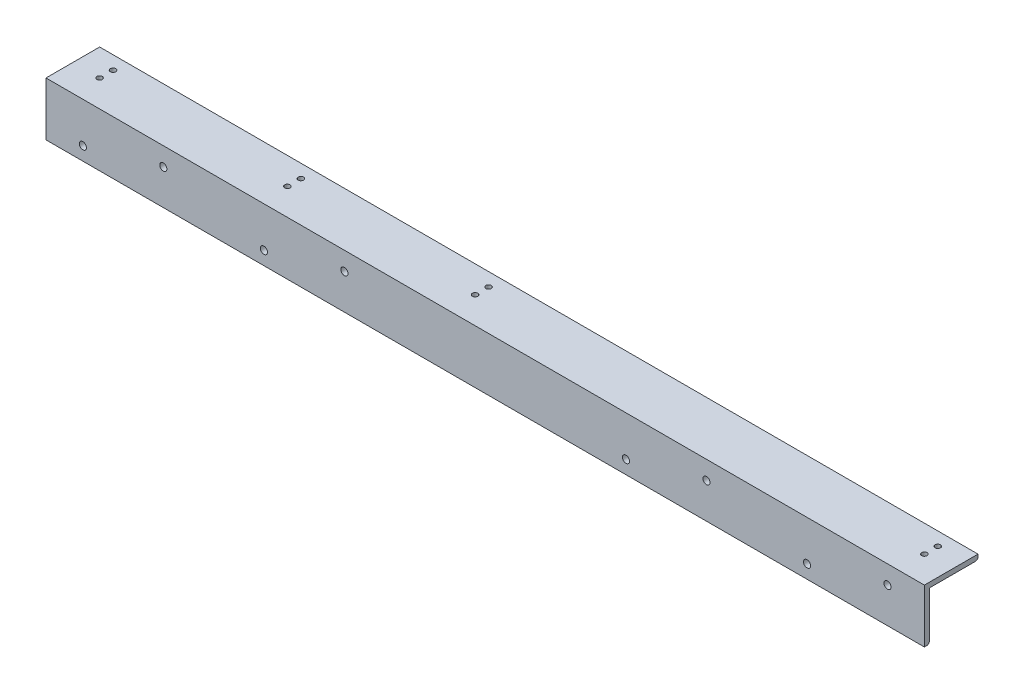
ISO-10303-21;
HEADER;
FILE_DESCRIPTION(('STEP AP214'),'2;1');
FILE_NAME('part.step','',(''),(''),'','','');
FILE_SCHEMA(('AUTOMOTIVE_DESIGN { 1 0 10303 214 1 1 1 1 }'));
ENDSEC;
DATA;
#1=APPLICATION_CONTEXT('core data for automotive mechanical design processes');
#2=APPLICATION_PROTOCOL_DEFINITION('international standard','automotive_design',2000,#1);
#3=PRODUCT_CONTEXT('',#1,'mechanical');
#4=PRODUCT('Part','Part','',(#3));
#5=PRODUCT_RELATED_PRODUCT_CATEGORY('part','',(#4));
#6=PRODUCT_DEFINITION_FORMATION('','',#4);
#7=PRODUCT_DEFINITION_CONTEXT('part definition',#1,'design');
#8=PRODUCT_DEFINITION('design','',#6,#7);
#9=PRODUCT_DEFINITION_SHAPE('','',#8);
#10=(LENGTH_UNIT() NAMED_UNIT(*) SI_UNIT(.MILLI.,.METRE.));
#11=(NAMED_UNIT(*) PLANE_ANGLE_UNIT() SI_UNIT($,.RADIAN.));
#12=(NAMED_UNIT(*) SI_UNIT($,.STERADIAN.) SOLID_ANGLE_UNIT());
#13=UNCERTAINTY_MEASURE_WITH_UNIT(LENGTH_MEASURE(1.E-05),#10,'distance_accuracy_value','');
#14=(GEOMETRIC_REPRESENTATION_CONTEXT(3) GLOBAL_UNCERTAINTY_ASSIGNED_CONTEXT((#13)) GLOBAL_UNIT_ASSIGNED_CONTEXT((#10,
#11,#12)) REPRESENTATION_CONTEXT('',''));
#15=CARTESIAN_POINT('',(0.,0.,0.));
#16=DIRECTION('',(0.,0.,1.));
#17=DIRECTION('',(1.,0.,0.));
#18=AXIS2_PLACEMENT_3D('',#15,#16,#17);
#19=CARTESIAN_POINT('',(415.925,-4.7625,-4.7625));
#20=DIRECTION('',(0.,0.,1.));
#21=DIRECTION('',(0.,-1.,0.));
#22=AXIS2_PLACEMENT_3D('',#19,#20,#21);
#23=PLANE('',#22);
#24=CARTESIAN_POINT('',(-381.,-38.1,-4.7625));
#25=DIRECTION('',(0.,0.,-1.));
#26=DIRECTION('',(0.,1.,0.));
#27=AXIS2_PLACEMENT_3D('',#24,#25,#26);
#28=CIRCLE('',#27,3.3782);
#29=CARTESIAN_POINT('',(-381.,-34.7218,-4.7625));
#30=VERTEX_POINT('',#29);
#31=EDGE_CURVE('E217',#30,#30,#28,.T.);
#32=ORIENTED_EDGE('',*,*,#31,.F.);
#33=EDGE_LOOP('',(#32));
#34=FACE_BOUND('',#33,.T.);
#35=DIRECTION('',(0.,1.,0.));
#36=VECTOR('',#35,1.);
#37=CARTESIAN_POINT('',(-415.925,-4.7625,-4.7625));
#38=LINE('',#37,#36);
#39=CARTESIAN_POINT('',(-415.925,-48.26,-4.7625));
#40=VERTEX_POINT('',#39);
#41=CARTESIAN_POINT('',(-415.925,-4.7625,-4.7625));
#42=VERTEX_POINT('',#41);
#43=EDGE_CURVE('E139',#40,#42,#38,.T.);
#44=ORIENTED_EDGE('',*,*,#43,.T.);
#45=DIRECTION('',(-1.,0.,0.));
#46=VECTOR('',#45,1.);
#47=CARTESIAN_POINT('',(415.925,-4.7625,-4.7625));
#48=LINE('',#47,#46);
#49=CARTESIAN_POINT('',(415.925,-4.7625,-4.7625));
#50=VERTEX_POINT('',#49);
#51=EDGE_CURVE('E150',#50,#42,#48,.T.);
#52=ORIENTED_EDGE('',*,*,#51,.F.);
#53=DIRECTION('',(0.,1.,0.));
#54=VECTOR('',#53,1.);
#55=CARTESIAN_POINT('',(415.925,-4.7625,-4.7625));
#56=LINE('',#55,#54);
#57=CARTESIAN_POINT('',(415.925,-48.26,-4.7625));
#58=VERTEX_POINT('',#57);
#59=EDGE_CURVE('E173',#58,#50,#56,.T.);
#60=ORIENTED_EDGE('',*,*,#59,.F.);
#61=DIRECTION('',(-1.,0.,0.));
#62=VECTOR('',#61,1.);
#63=CARTESIAN_POINT('',(415.925,-48.26,-4.7625));
#64=LINE('',#63,#62);
#65=EDGE_CURVE('E153',#58,#40,#64,.T.);
#66=ORIENTED_EDGE('',*,*,#65,.T.);
#67=EDGE_LOOP('',(#44,#52,#60,#66));
#68=FACE_BOUND('',#67,.T.);
#69=CARTESIAN_POINT('',(304.8,-38.1,-4.7625));
#70=DIRECTION('',(0.,0.,-1.));
#71=DIRECTION('',(0.,1.,0.));
#72=AXIS2_PLACEMENT_3D('',#69,#70,#71);
#73=CIRCLE('',#72,3.3782);
#74=CARTESIAN_POINT('',(304.8,-34.7218,-4.7625));
#75=VERTEX_POINT('',#74);
#76=EDGE_CURVE('E181',#75,#75,#73,.T.);
#77=ORIENTED_EDGE('',*,*,#76,.F.);
#78=EDGE_LOOP('',(#77));
#79=FACE_BOUND('',#78,.T.);
#80=CARTESIAN_POINT('',(381.,-17.4625,-4.7625));
#81=DIRECTION('',(0.,0.,-1.));
#82=DIRECTION('',(0.,1.,0.));
#83=AXIS2_PLACEMENT_3D('',#80,#81,#82);
#84=CIRCLE('',#83,3.3782);
#85=CARTESIAN_POINT('',(381.,-14.0843,-4.7625));
#86=VERTEX_POINT('',#85);
#87=EDGE_CURVE('E187',#86,#86,#84,.T.);
#88=ORIENTED_EDGE('',*,*,#87,.F.);
#89=EDGE_LOOP('',(#88));
#90=FACE_BOUND('',#89,.T.);
#91=CARTESIAN_POINT('',(133.35,-38.1,-4.7625));
#92=DIRECTION('',(0.,0.,-1.));
#93=DIRECTION('',(0.,1.,0.));
#94=AXIS2_PLACEMENT_3D('',#91,#92,#93);
#95=CIRCLE('',#94,3.3782);
#96=CARTESIAN_POINT('',(133.35,-34.7218,-4.7625));
#97=VERTEX_POINT('',#96);
#98=EDGE_CURVE('E193',#97,#97,#95,.T.);
#99=ORIENTED_EDGE('',*,*,#98,.F.);
#100=EDGE_LOOP('',(#99));
#101=FACE_BOUND('',#100,.T.);
#102=CARTESIAN_POINT('',(209.55,-17.4625,-4.7625));
#103=DIRECTION('',(0.,0.,-1.));
#104=DIRECTION('',(0.,1.,0.));
#105=AXIS2_PLACEMENT_3D('',#102,#103,#104);
#106=CIRCLE('',#105,3.3782);
#107=CARTESIAN_POINT('',(209.55,-14.0843,-4.7625));
#108=VERTEX_POINT('',#107);
#109=EDGE_CURVE('E199',#108,#108,#106,.T.);
#110=ORIENTED_EDGE('',*,*,#109,.F.);
#111=EDGE_LOOP('',(#110));
#112=FACE_BOUND('',#111,.T.);
#113=CARTESIAN_POINT('',(-209.55,-38.1,-4.7625));
#114=DIRECTION('',(0.,0.,-1.));
#115=DIRECTION('',(0.,1.,0.));
#116=AXIS2_PLACEMENT_3D('',#113,#114,#115);
#117=CIRCLE('',#116,3.3782);
#118=CARTESIAN_POINT('',(-209.55,-34.7218,-4.7625));
#119=VERTEX_POINT('',#118);
#120=EDGE_CURVE('E205',#119,#119,#117,.T.);
#121=ORIENTED_EDGE('',*,*,#120,.F.);
#122=EDGE_LOOP('',(#121));
#123=FACE_BOUND('',#122,.T.);
#124=CARTESIAN_POINT('',(-133.35,-17.4625,-4.7625));
#125=DIRECTION('',(0.,0.,-1.));
#126=DIRECTION('',(0.,1.,0.));
#127=AXIS2_PLACEMENT_3D('',#124,#125,#126);
#128=CIRCLE('',#127,3.3782);
#129=CARTESIAN_POINT('',(-133.35,-14.0843,-4.7625));
#130=VERTEX_POINT('',#129);
#131=EDGE_CURVE('E211',#130,#130,#128,.T.);
#132=ORIENTED_EDGE('',*,*,#131,.F.);
#133=EDGE_LOOP('',(#132));
#134=FACE_BOUND('',#133,.T.);
#135=CARTESIAN_POINT('',(-304.8,-17.4625,-4.7625));
#136=DIRECTION('',(0.,0.,-1.));
#137=DIRECTION('',(0.,1.,0.));
#138=AXIS2_PLACEMENT_3D('',#135,#136,#137);
#139=CIRCLE('',#138,3.3782);
#140=CARTESIAN_POINT('',(-304.8,-14.0843,-4.7625));
#141=VERTEX_POINT('',#140);
#142=EDGE_CURVE('E223',#141,#141,#139,.T.);
#143=ORIENTED_EDGE('',*,*,#142,.F.);
#144=EDGE_LOOP('',(#143));
#145=FACE_BOUND('',#144,.T.);
#146=ADVANCED_FACE('F34',(#34,#68,#79,#90,#101,#112,#123,#134,#145),#23,.F.);
#147=CARTESIAN_POINT('',(415.925,-50.8,0.));
#148=DIRECTION('',(0.,0.,-1.));
#149=DIRECTION('',(-1.,0.,0.));
#150=AXIS2_PLACEMENT_3D('',#147,#148,#149);
#151=PLANE('',#150);
#152=CARTESIAN_POINT('',(-304.8,-17.4625,0.));
#153=DIRECTION('',(0.,0.,-1.));
#154=DIRECTION('',(-1.,0.,0.));
#155=AXIS2_PLACEMENT_3D('',#152,#153,#154);
#156=CIRCLE('',#155,3.3782);
#157=CARTESIAN_POINT('',(-308.1782,-17.4625,0.));
#158=VERTEX_POINT('',#157);
#159=EDGE_CURVE('E220',#158,#158,#156,.T.);
#160=ORIENTED_EDGE('',*,*,#159,.T.);
#161=EDGE_LOOP('',(#160));
#162=FACE_BOUND('',#161,.T.);
#163=CARTESIAN_POINT('',(-381.,-38.1,0.));
#164=DIRECTION('',(0.,0.,-1.));
#165=DIRECTION('',(-1.,0.,0.));
#166=AXIS2_PLACEMENT_3D('',#163,#164,#165);
#167=CIRCLE('',#166,3.3782);
#168=CARTESIAN_POINT('',(-384.3782,-38.1,0.));
#169=VERTEX_POINT('',#168);
#170=EDGE_CURVE('E214',#169,#169,#167,.T.);
#171=ORIENTED_EDGE('',*,*,#170,.T.);
#172=EDGE_LOOP('',(#171));
#173=FACE_BOUND('',#172,.T.);
#174=CARTESIAN_POINT('',(-133.35,-17.4625,0.));
#175=DIRECTION('',(0.,0.,-1.));
#176=DIRECTION('',(-1.,0.,0.));
#177=AXIS2_PLACEMENT_3D('',#174,#175,#176);
#178=CIRCLE('',#177,3.3782);
#179=CARTESIAN_POINT('',(-136.7282,-17.4625,0.));
#180=VERTEX_POINT('',#179);
#181=EDGE_CURVE('E208',#180,#180,#178,.T.);
#182=ORIENTED_EDGE('',*,*,#181,.T.);
#183=EDGE_LOOP('',(#182));
#184=FACE_BOUND('',#183,.T.);
#185=CARTESIAN_POINT('',(-209.55,-38.1,0.));
#186=DIRECTION('',(0.,0.,-1.));
#187=DIRECTION('',(-1.,0.,0.));
#188=AXIS2_PLACEMENT_3D('',#185,#186,#187);
#189=CIRCLE('',#188,3.3782);
#190=CARTESIAN_POINT('',(-212.9282,-38.1,0.));
#191=VERTEX_POINT('',#190);
#192=EDGE_CURVE('E202',#191,#191,#189,.T.);
#193=ORIENTED_EDGE('',*,*,#192,.T.);
#194=EDGE_LOOP('',(#193));
#195=FACE_BOUND('',#194,.T.);
#196=CARTESIAN_POINT('',(209.55,-17.4625,0.));
#197=DIRECTION('',(0.,0.,-1.));
#198=DIRECTION('',(-1.,0.,0.));
#199=AXIS2_PLACEMENT_3D('',#196,#197,#198);
#200=CIRCLE('',#199,3.3782);
#201=CARTESIAN_POINT('',(206.1718,-17.4625,0.));
#202=VERTEX_POINT('',#201);
#203=EDGE_CURVE('E196',#202,#202,#200,.T.);
#204=ORIENTED_EDGE('',*,*,#203,.T.);
#205=EDGE_LOOP('',(#204));
#206=FACE_BOUND('',#205,.T.);
#207=CARTESIAN_POINT('',(133.35,-38.1,0.));
#208=DIRECTION('',(0.,0.,-1.));
#209=DIRECTION('',(-1.,0.,0.));
#210=AXIS2_PLACEMENT_3D('',#207,#208,#209);
#211=CIRCLE('',#210,3.3782);
#212=CARTESIAN_POINT('',(129.9718,-38.1,0.));
#213=VERTEX_POINT('',#212);
#214=EDGE_CURVE('E190',#213,#213,#211,.T.);
#215=ORIENTED_EDGE('',*,*,#214,.T.);
#216=EDGE_LOOP('',(#215));
#217=FACE_BOUND('',#216,.T.);
#218=CARTESIAN_POINT('',(381.,-17.4625,0.));
#219=DIRECTION('',(0.,0.,-1.));
#220=DIRECTION('',(-1.,0.,0.));
#221=AXIS2_PLACEMENT_3D('',#218,#219,#220);
#222=CIRCLE('',#221,3.3782);
#223=CARTESIAN_POINT('',(377.6218,-17.4625,0.));
#224=VERTEX_POINT('',#223);
#225=EDGE_CURVE('E184',#224,#224,#222,.T.);
#226=ORIENTED_EDGE('',*,*,#225,.T.);
#227=EDGE_LOOP('',(#226));
#228=FACE_BOUND('',#227,.T.);
#229=CARTESIAN_POINT('',(304.8,-38.1,0.));
#230=DIRECTION('',(0.,0.,-1.));
#231=DIRECTION('',(-1.,0.,0.));
#232=AXIS2_PLACEMENT_3D('',#229,#230,#231);
#233=CIRCLE('',#232,3.3782);
#234=CARTESIAN_POINT('',(301.4218,-38.1,0.));
#235=VERTEX_POINT('',#234);
#236=EDGE_CURVE('E135',#235,#235,#233,.T.);
#237=ORIENTED_EDGE('',*,*,#236,.T.);
#238=EDGE_LOOP('',(#237));
#239=FACE_BOUND('',#238,.T.);
#240=DIRECTION('',(0.,-1.,0.));
#241=VECTOR('',#240,1.);
#242=CARTESIAN_POINT('',(-415.925,-50.8,0.));
#243=LINE('',#242,#241);
#244=CARTESIAN_POINT('',(-415.925,0.,0.));
#245=VERTEX_POINT('',#244);
#246=CARTESIAN_POINT('',(-415.925,-50.8,0.));
#247=VERTEX_POINT('',#246);
#248=EDGE_CURVE('E131',#245,#247,#243,.T.);
#249=ORIENTED_EDGE('',*,*,#248,.T.);
#250=DIRECTION('',(-1.,0.,0.));
#251=VECTOR('',#250,1.);
#252=CARTESIAN_POINT('',(415.925,-50.8,0.));
#253=LINE('',#252,#251);
#254=CARTESIAN_POINT('',(415.925,-50.8,0.));
#255=VERTEX_POINT('',#254);
#256=EDGE_CURVE('E11',#255,#247,#253,.T.);
#257=ORIENTED_EDGE('',*,*,#256,.F.);
#258=DIRECTION('',(0.,-1.,0.));
#259=VECTOR('',#258,1.);
#260=CARTESIAN_POINT('',(415.925,-50.8,0.));
#261=LINE('',#260,#259);
#262=CARTESIAN_POINT('',(415.925,0.,0.));
#263=VERTEX_POINT('',#262);
#264=EDGE_CURVE('E146',#263,#255,#261,.T.);
#265=ORIENTED_EDGE('',*,*,#264,.F.);
#266=DIRECTION('',(-1.,0.,0.));
#267=VECTOR('',#266,1.);
#268=CARTESIAN_POINT('',(415.925,0.,0.));
#269=LINE('',#268,#267);
#270=EDGE_CURVE('E127',#263,#245,#269,.T.);
#271=ORIENTED_EDGE('',*,*,#270,.T.);
#272=EDGE_LOOP('',(#249,#257,#265,#271));
#273=FACE_BOUND('',#272,.T.);
#274=ADVANCED_FACE('F36',(#162,#173,#184,#195,#206,#217,#228,#239,#273),#151,.F.);
#275=CARTESIAN_POINT('',(415.925,-50.8,-2.22249999999996));
#276=DIRECTION('',(0.,1.,0.));
#277=DIRECTION('',(0.,0.,1.));
#278=AXIS2_PLACEMENT_3D('',#275,#276,#277);
#279=PLANE('',#278);
#280=DIRECTION('',(0.,0.,-1.));
#281=VECTOR('',#280,1.);
#282=CARTESIAN_POINT('',(-415.925,-50.8,-2.22249999999996));
#283=LINE('',#282,#281);
#284=CARTESIAN_POINT('',(-415.925,-50.8,-2.22249999999996));
#285=VERTEX_POINT('',#284);
#286=EDGE_CURVE('E134',#247,#285,#283,.T.);
#287=ORIENTED_EDGE('',*,*,#286,.T.);
#288=DIRECTION('',(-1.,0.,0.));
#289=VECTOR('',#288,1.);
#290=CARTESIAN_POINT('',(415.925,-50.8,-2.22249999999996));
#291=LINE('',#290,#289);
#292=CARTESIAN_POINT('',(415.925,-50.8,-2.22249999999996));
#293=VERTEX_POINT('',#292);
#294=EDGE_CURVE('E43',#293,#285,#291,.T.);
#295=ORIENTED_EDGE('',*,*,#294,.F.);
#296=DIRECTION('',(0.,0.,-1.));
#297=VECTOR('',#296,1.);
#298=CARTESIAN_POINT('',(415.925,-50.8,-2.22249999999996));
#299=LINE('',#298,#297);
#300=EDGE_CURVE('E94',#255,#293,#299,.T.);
#301=ORIENTED_EDGE('',*,*,#300,.F.);
#302=ORIENTED_EDGE('',*,*,#256,.T.);
#303=EDGE_LOOP('',(#287,#295,#301,#302));
#304=FACE_BOUND('',#303,.T.);
#305=ADVANCED_FACE('F322',(#304),#279,.F.);
#306=CARTESIAN_POINT('',(415.925,-48.26,-2.22249999999996));
#307=DIRECTION('',(-1.,0.,0.));
#308=DIRECTION('',(0.,0.,1.));
#309=AXIS2_PLACEMENT_3D('',#306,#307,#308);
#310=CYLINDRICAL_SURFACE('',#309,2.54);
#311=CARTESIAN_POINT('',(-415.925,-48.26,-2.22249999999996));
#312=DIRECTION('',(1.,0.,0.));
#313=DIRECTION('',(0.,0.,1.));
#314=AXIS2_PLACEMENT_3D('',#311,#312,#313);
#315=CIRCLE('',#314,2.54);
#316=EDGE_CURVE('E137',#285,#40,#315,.T.);
#317=ORIENTED_EDGE('',*,*,#316,.T.);
#318=ORIENTED_EDGE('',*,*,#65,.F.);
#319=CARTESIAN_POINT('',(415.925,-48.26,-2.22249999999996));
#320=DIRECTION('',(1.,0.,0.));
#321=DIRECTION('',(0.,0.,1.));
#322=AXIS2_PLACEMENT_3D('',#319,#320,#321);
#323=CIRCLE('',#322,2.54);
#324=EDGE_CURVE('E161',#293,#58,#323,.T.);
#325=ORIENTED_EDGE('',*,*,#324,.F.);
#326=ORIENTED_EDGE('',*,*,#294,.T.);
#327=EDGE_LOOP('',(#317,#318,#325,#326));
#328=FACE_BOUND('',#327,.T.);
#329=ADVANCED_FACE('F159',(#328),#310,.T.);
#330=CARTESIAN_POINT('',(415.925,-4.7625,-48.26));
#331=DIRECTION('',(0.,1.,0.));
#332=DIRECTION('',(0.,0.,1.));
#333=AXIS2_PLACEMENT_3D('',#330,#331,#332);
#334=PLANE('',#333);
#335=CARTESIAN_POINT('',(-34.925,-4.7625,-25.4));
#336=DIRECTION('',(0.,1.,0.));
#337=DIRECTION('',(0.,0.,1.));
#338=AXIS2_PLACEMENT_3D('',#335,#336,#337);
#339=CIRCLE('',#338,2.55269999999999);
#340=CARTESIAN_POINT('',(-34.925,-4.7625,-22.8473));
#341=VERTEX_POINT('',#340);
#342=EDGE_CURVE('E266',#341,#341,#339,.F.);
#343=ORIENTED_EDGE('',*,*,#342,.F.);
#344=EDGE_LOOP('',(#343));
#345=FACE_BOUND('',#344,.T.);
#346=CARTESIAN_POINT('',(-34.925,-4.7625,-38.1));
#347=DIRECTION('',(0.,1.,0.));
#348=DIRECTION('',(0.,0.,1.));
#349=AXIS2_PLACEMENT_3D('',#346,#347,#348);
#350=CIRCLE('',#349,2.55269999999999);
#351=CARTESIAN_POINT('',(-34.925,-4.7625,-35.5473));
#352=VERTEX_POINT('',#351);
#353=EDGE_CURVE('E260',#352,#352,#350,.F.);
#354=ORIENTED_EDGE('',*,*,#353,.F.);
#355=EDGE_LOOP('',(#354));
#356=FACE_BOUND('',#355,.T.);
#357=CARTESIAN_POINT('',(-212.725,-4.7625,-38.1));
#358=DIRECTION('',(0.,1.,0.));
#359=DIRECTION('',(0.,0.,1.));
#360=AXIS2_PLACEMENT_3D('',#357,#358,#359);
#361=CIRCLE('',#360,2.55269999999999);
#362=CARTESIAN_POINT('',(-212.725,-4.7625,-35.5473));
#363=VERTEX_POINT('',#362);
#364=EDGE_CURVE('E254',#363,#363,#361,.F.);
#365=ORIENTED_EDGE('',*,*,#364,.F.);
#366=EDGE_LOOP('',(#365));
#367=FACE_BOUND('',#366,.T.);
#368=CARTESIAN_POINT('',(-212.725,-4.7625,-25.4));
#369=DIRECTION('',(0.,1.,0.));
#370=DIRECTION('',(0.,0.,1.));
#371=AXIS2_PLACEMENT_3D('',#368,#369,#370);
#372=CIRCLE('',#371,2.55269999999999);
#373=CARTESIAN_POINT('',(-212.725,-4.7625,-22.8473));
#374=VERTEX_POINT('',#373);
#375=EDGE_CURVE('E248',#374,#374,#372,.F.);
#376=ORIENTED_EDGE('',*,*,#375,.F.);
#377=EDGE_LOOP('',(#376));
#378=FACE_BOUND('',#377,.T.);
#379=CARTESIAN_POINT('',(-390.525,-4.7625,-25.4));
#380=DIRECTION('',(0.,1.,0.));
#381=DIRECTION('',(0.,0.,1.));
#382=AXIS2_PLACEMENT_3D('',#379,#380,#381);
#383=CIRCLE('',#382,2.55269999999999);
#384=CARTESIAN_POINT('',(-390.525,-4.7625,-22.8473));
#385=VERTEX_POINT('',#384);
#386=EDGE_CURVE('E242',#385,#385,#383,.F.);
#387=ORIENTED_EDGE('',*,*,#386,.F.);
#388=EDGE_LOOP('',(#387));
#389=FACE_BOUND('',#388,.T.);
#390=CARTESIAN_POINT('',(-390.525,-4.7625,-38.1));
#391=DIRECTION('',(0.,1.,0.));
#392=DIRECTION('',(0.,0.,1.));
#393=AXIS2_PLACEMENT_3D('',#390,#391,#392);
#394=CIRCLE('',#393,2.55269999999999);
#395=CARTESIAN_POINT('',(-390.525,-4.7625,-35.5473));
#396=VERTEX_POINT('',#395);
#397=EDGE_CURVE('E236',#396,#396,#394,.F.);
#398=ORIENTED_EDGE('',*,*,#397,.F.);
#399=EDGE_LOOP('',(#398));
#400=FACE_BOUND('',#399,.T.);
#401=CARTESIAN_POINT('',(390.525,-4.7625,-38.1));
#402=DIRECTION('',(0.,1.,0.));
#403=DIRECTION('',(0.,0.,1.));
#404=AXIS2_PLACEMENT_3D('',#401,#402,#403);
#405=CIRCLE('',#404,2.55269999999999);
#406=CARTESIAN_POINT('',(390.525,-4.7625,-35.5473));
#407=VERTEX_POINT('',#406);
#408=EDGE_CURVE('E230',#407,#407,#405,.F.);
#409=ORIENTED_EDGE('',*,*,#408,.F.);
#410=EDGE_LOOP('',(#409));
#411=FACE_BOUND('',#410,.T.);
#412=CARTESIAN_POINT('',(390.525,-4.7625,-25.4));
#413=DIRECTION('',(0.,1.,0.));
#414=DIRECTION('',(0.,0.,1.));
#415=AXIS2_PLACEMENT_3D('',#412,#413,#414);
#416=CIRCLE('',#415,2.55269999999999);
#417=CARTESIAN_POINT('',(390.525,-4.7625,-22.8473));
#418=VERTEX_POINT('',#417);
#419=EDGE_CURVE('E226',#418,#418,#416,.F.);
#420=ORIENTED_EDGE('',*,*,#419,.F.);
#421=EDGE_LOOP('',(#420));
#422=FACE_BOUND('',#421,.T.);
#423=DIRECTION('',(0.,0.,-1.));
#424=VECTOR('',#423,1.);
#425=CARTESIAN_POINT('',(-415.925,-4.7625,-48.26));
#426=LINE('',#425,#424);
#427=CARTESIAN_POINT('',(-415.925,-4.7625,-48.26));
#428=VERTEX_POINT('',#427);
#429=EDGE_CURVE('E141',#42,#428,#426,.T.);
#430=ORIENTED_EDGE('',*,*,#429,.T.);
#431=DIRECTION('',(-1.,0.,0.));
#432=VECTOR('',#431,1.);
#433=CARTESIAN_POINT('',(415.925,-4.7625,-48.26));
#434=LINE('',#433,#432);
#435=CARTESIAN_POINT('',(415.925,-4.7625,-48.26));
#436=VERTEX_POINT('',#435);
#437=EDGE_CURVE('E122',#436,#428,#434,.T.);
#438=ORIENTED_EDGE('',*,*,#437,.F.);
#439=DIRECTION('',(0.,0.,-1.));
#440=VECTOR('',#439,1.);
#441=CARTESIAN_POINT('',(415.925,-4.7625,-48.26));
#442=LINE('',#441,#440);
#443=EDGE_CURVE('E113',#50,#436,#442,.T.);
#444=ORIENTED_EDGE('',*,*,#443,.F.);
#445=ORIENTED_EDGE('',*,*,#51,.T.);
#446=EDGE_LOOP('',(#430,#438,#444,#445));
#447=FACE_BOUND('',#446,.T.);
#448=ADVANCED_FACE('F172',(#345,#356,#367,#378,#389,#400,#411,#422,#447),#334,.F.);
#449=CARTESIAN_POINT('',(415.925,-2.22249999999999,-48.26));
#450=DIRECTION('',(-1.,0.,0.));
#451=DIRECTION('',(0.,0.,1.));
#452=AXIS2_PLACEMENT_3D('',#449,#450,#451);
#453=CYLINDRICAL_SURFACE('',#452,2.54);
#454=CARTESIAN_POINT('',(-415.925,-2.22249999999999,-48.26));
#455=DIRECTION('',(1.,0.,0.));
#456=DIRECTION('',(0.,0.,1.));
#457=AXIS2_PLACEMENT_3D('',#454,#455,#456);
#458=CIRCLE('',#457,2.54);
#459=CARTESIAN_POINT('',(-415.925,-2.22249999999999,-50.8));
#460=VERTEX_POINT('',#459);
#461=EDGE_CURVE('E121',#428,#460,#458,.T.);
#462=ORIENTED_EDGE('',*,*,#461,.T.);
#463=DIRECTION('',(-1.,0.,0.));
#464=VECTOR('',#463,1.);
#465=CARTESIAN_POINT('',(415.925,-2.22249999999999,-50.8));
#466=LINE('',#465,#464);
#467=CARTESIAN_POINT('',(415.925,-2.22249999999999,-50.8));
#468=VERTEX_POINT('',#467);
#469=EDGE_CURVE('E118',#468,#460,#466,.T.);
#470=ORIENTED_EDGE('',*,*,#469,.F.);
#471=CARTESIAN_POINT('',(415.925,-2.22249999999999,-48.26));
#472=DIRECTION('',(1.,0.,0.));
#473=DIRECTION('',(0.,0.,1.));
#474=AXIS2_PLACEMENT_3D('',#471,#472,#473);
#475=CIRCLE('',#474,2.54);
#476=EDGE_CURVE('E107',#436,#468,#475,.T.);
#477=ORIENTED_EDGE('',*,*,#476,.F.);
#478=ORIENTED_EDGE('',*,*,#437,.T.);
#479=EDGE_LOOP('',(#462,#470,#477,#478));
#480=FACE_BOUND('',#479,.T.);
#481=ADVANCED_FACE('F119',(#480),#453,.T.);
#482=CARTESIAN_POINT('',(415.925,0.,-50.8));
#483=DIRECTION('',(0.,0.,1.));
#484=DIRECTION('',(1.,0.,0.));
#485=AXIS2_PLACEMENT_3D('',#482,#483,#484);
#486=PLANE('',#485);
#487=DIRECTION('',(0.,1.,0.));
#488=VECTOR('',#487,1.);
#489=CARTESIAN_POINT('',(-415.925,0.,-50.8));
#490=LINE('',#489,#488);
#491=CARTESIAN_POINT('',(-415.925,0.,-50.8));
#492=VERTEX_POINT('',#491);
#493=EDGE_CURVE('E80',#460,#492,#490,.T.);
#494=ORIENTED_EDGE('',*,*,#493,.T.);
#495=DIRECTION('',(-1.,0.,0.));
#496=VECTOR('',#495,1.);
#497=CARTESIAN_POINT('',(415.925,0.,-50.8));
#498=LINE('',#497,#496);
#499=CARTESIAN_POINT('',(415.925,0.,-50.8));
#500=VERTEX_POINT('',#499);
#501=EDGE_CURVE('E123',#500,#492,#498,.T.);
#502=ORIENTED_EDGE('',*,*,#501,.F.);
#503=DIRECTION('',(0.,1.,0.));
#504=VECTOR('',#503,1.);
#505=CARTESIAN_POINT('',(415.925,0.,-50.8));
#506=LINE('',#505,#504);
#507=EDGE_CURVE('E111',#468,#500,#506,.T.);
#508=ORIENTED_EDGE('',*,*,#507,.F.);
#509=ORIENTED_EDGE('',*,*,#469,.T.);
#510=EDGE_LOOP('',(#494,#502,#508,#509));
#511=FACE_BOUND('',#510,.T.);
#512=ADVANCED_FACE('F125',(#511),#486,.F.);
#513=CARTESIAN_POINT('',(415.925,0.,0.));
#514=DIRECTION('',(0.,-1.,0.));
#515=DIRECTION('',(0.,0.,-1.));
#516=AXIS2_PLACEMENT_3D('',#513,#514,#515);
#517=PLANE('',#516);
#518=CARTESIAN_POINT('',(-34.925,0.,-25.4));
#519=DIRECTION('',(0.,1.,0.));
#520=DIRECTION('',(0.,0.,1.));
#521=AXIS2_PLACEMENT_3D('',#518,#519,#520);
#522=CIRCLE('',#521,2.55269999999999);
#523=CARTESIAN_POINT('',(-34.925,0.,-22.8473));
#524=VERTEX_POINT('',#523);
#525=EDGE_CURVE('E269',#524,#524,#522,.T.);
#526=ORIENTED_EDGE('',*,*,#525,.F.);
#527=EDGE_LOOP('',(#526));
#528=FACE_BOUND('',#527,.T.);
#529=CARTESIAN_POINT('',(-34.925,0.,-38.1));
#530=DIRECTION('',(0.,1.,0.));
#531=DIRECTION('',(0.,0.,1.));
#532=AXIS2_PLACEMENT_3D('',#529,#530,#531);
#533=CIRCLE('',#532,2.55269999999999);
#534=CARTESIAN_POINT('',(-34.925,0.,-35.5473));
#535=VERTEX_POINT('',#534);
#536=EDGE_CURVE('E263',#535,#535,#533,.T.);
#537=ORIENTED_EDGE('',*,*,#536,.F.);
#538=EDGE_LOOP('',(#537));
#539=FACE_BOUND('',#538,.T.);
#540=CARTESIAN_POINT('',(-212.725,0.,-38.1));
#541=DIRECTION('',(0.,1.,0.));
#542=DIRECTION('',(0.,0.,1.));
#543=AXIS2_PLACEMENT_3D('',#540,#541,#542);
#544=CIRCLE('',#543,2.55269999999999);
#545=CARTESIAN_POINT('',(-212.725,0.,-35.5473));
#546=VERTEX_POINT('',#545);
#547=EDGE_CURVE('E257',#546,#546,#544,.T.);
#548=ORIENTED_EDGE('',*,*,#547,.F.);
#549=EDGE_LOOP('',(#548));
#550=FACE_BOUND('',#549,.T.);
#551=CARTESIAN_POINT('',(-212.725,0.,-25.4));
#552=DIRECTION('',(0.,1.,0.));
#553=DIRECTION('',(0.,0.,1.));
#554=AXIS2_PLACEMENT_3D('',#551,#552,#553);
#555=CIRCLE('',#554,2.55269999999999);
#556=CARTESIAN_POINT('',(-212.725,0.,-22.8473));
#557=VERTEX_POINT('',#556);
#558=EDGE_CURVE('E251',#557,#557,#555,.T.);
#559=ORIENTED_EDGE('',*,*,#558,.F.);
#560=EDGE_LOOP('',(#559));
#561=FACE_BOUND('',#560,.T.);
#562=CARTESIAN_POINT('',(-390.525,0.,-25.4));
#563=DIRECTION('',(0.,1.,0.));
#564=DIRECTION('',(0.,0.,1.));
#565=AXIS2_PLACEMENT_3D('',#562,#563,#564);
#566=CIRCLE('',#565,2.55269999999996);
#567=CARTESIAN_POINT('',(-390.525,0.,-22.8473000000001));
#568=VERTEX_POINT('',#567);
#569=EDGE_CURVE('E245',#568,#568,#566,.T.);
#570=ORIENTED_EDGE('',*,*,#569,.F.);
#571=EDGE_LOOP('',(#570));
#572=FACE_BOUND('',#571,.T.);
#573=CARTESIAN_POINT('',(-390.525,0.,-38.1));
#574=DIRECTION('',(0.,1.,0.));
#575=DIRECTION('',(0.,0.,1.));
#576=AXIS2_PLACEMENT_3D('',#573,#574,#575);
#577=CIRCLE('',#576,2.55269999999996);
#578=CARTESIAN_POINT('',(-390.525,0.,-35.5473));
#579=VERTEX_POINT('',#578);
#580=EDGE_CURVE('E239',#579,#579,#577,.T.);
#581=ORIENTED_EDGE('',*,*,#580,.F.);
#582=EDGE_LOOP('',(#581));
#583=FACE_BOUND('',#582,.T.);
#584=CARTESIAN_POINT('',(390.525,0.,-38.1));
#585=DIRECTION('',(0.,1.,0.));
#586=DIRECTION('',(0.,0.,1.));
#587=AXIS2_PLACEMENT_3D('',#584,#585,#586);
#588=CIRCLE('',#587,2.55269999999996);
#589=CARTESIAN_POINT('',(390.525,0.,-35.5473));
#590=VERTEX_POINT('',#589);
#591=EDGE_CURVE('E233',#590,#590,#588,.T.);
#592=ORIENTED_EDGE('',*,*,#591,.F.);
#593=EDGE_LOOP('',(#592));
#594=FACE_BOUND('',#593,.T.);
#595=CARTESIAN_POINT('',(390.525,0.,-25.4));
#596=DIRECTION('',(0.,1.,0.));
#597=DIRECTION('',(0.,0.,1.));
#598=AXIS2_PLACEMENT_3D('',#595,#596,#597);
#599=CIRCLE('',#598,2.55269999999996);
#600=CARTESIAN_POINT('',(390.525,0.,-22.8473000000001));
#601=VERTEX_POINT('',#600);
#602=EDGE_CURVE('E227',#601,#601,#599,.T.);
#603=ORIENTED_EDGE('',*,*,#602,.F.);
#604=EDGE_LOOP('',(#603));
#605=FACE_BOUND('',#604,.T.);
#606=DIRECTION('',(0.,0.,1.));
#607=VECTOR('',#606,1.);
#608=CARTESIAN_POINT('',(-415.925,0.,0.));
#609=LINE('',#608,#607);
#610=EDGE_CURVE('E86',#492,#245,#609,.T.);
#611=ORIENTED_EDGE('',*,*,#610,.T.);
#612=ORIENTED_EDGE('',*,*,#270,.F.);
#613=DIRECTION('',(0.,0.,1.));
#614=VECTOR('',#613,1.);
#615=CARTESIAN_POINT('',(415.925,0.,0.));
#616=LINE('',#615,#614);
#617=EDGE_CURVE('E51',#500,#263,#616,.T.);
#618=ORIENTED_EDGE('',*,*,#617,.F.);
#619=ORIENTED_EDGE('',*,*,#501,.T.);
#620=EDGE_LOOP('',(#611,#612,#618,#619));
#621=FACE_BOUND('',#620,.T.);
#622=ADVANCED_FACE('F303',(#528,#539,#550,#561,#572,#583,#594,#605,#621),#517,.F.);
#623=CARTESIAN_POINT('',(415.925,-2.22249999999999,-48.26));
#624=DIRECTION('',(-1.,0.,0.));
#625=DIRECTION('',(0.,0.,1.));
#626=AXIS2_PLACEMENT_3D('',#623,#624,#625);
#627=PLANE('',#626);
#628=ORIENTED_EDGE('',*,*,#264,.T.);
#629=ORIENTED_EDGE('',*,*,#300,.T.);
#630=ORIENTED_EDGE('',*,*,#324,.T.);
#631=ORIENTED_EDGE('',*,*,#59,.T.);
#632=ORIENTED_EDGE('',*,*,#443,.T.);
#633=ORIENTED_EDGE('',*,*,#476,.T.);
#634=ORIENTED_EDGE('',*,*,#507,.T.);
#635=ORIENTED_EDGE('',*,*,#617,.T.);
#636=EDGE_LOOP('',(#628,#629,#630,#631,#632,#633,#634,#635));
#637=FACE_BOUND('',#636,.T.);
#638=ADVANCED_FACE('F109',(#637),#627,.F.);
#639=CARTESIAN_POINT('',(-415.925,-2.22249999999999,-48.26));
#640=DIRECTION('',(-1.,0.,0.));
#641=DIRECTION('',(0.,0.,1.));
#642=AXIS2_PLACEMENT_3D('',#639,#640,#641);
#643=PLANE('',#642);
#644=ORIENTED_EDGE('',*,*,#248,.F.);
#645=ORIENTED_EDGE('',*,*,#610,.F.);
#646=ORIENTED_EDGE('',*,*,#493,.F.);
#647=ORIENTED_EDGE('',*,*,#461,.F.);
#648=ORIENTED_EDGE('',*,*,#429,.F.);
#649=ORIENTED_EDGE('',*,*,#43,.F.);
#650=ORIENTED_EDGE('',*,*,#316,.F.);
#651=ORIENTED_EDGE('',*,*,#286,.F.);
#652=EDGE_LOOP('',(#644,#645,#646,#647,#648,#649,#650,#651));
#653=FACE_BOUND('',#652,.T.);
#654=ADVANCED_FACE('F165',(#653),#643,.T.);
#655=CARTESIAN_POINT('',(304.8,-38.1,-4.7625));
#656=DIRECTION('',(0.,0.,-1.));
#657=DIRECTION('',(0.,1.,0.));
#658=AXIS2_PLACEMENT_3D('',#655,#656,#657);
#659=CYLINDRICAL_SURFACE('',#658,3.3782);
#660=ORIENTED_EDGE('',*,*,#236,.F.);
#661=EDGE_LOOP('',(#660));
#662=FACE_BOUND('',#661,.T.);
#663=ORIENTED_EDGE('',*,*,#76,.T.);
#664=EDGE_LOOP('',(#663));
#665=FACE_BOUND('',#664,.T.);
#666=ADVANCED_FACE('F366',(#662,#665),#659,.F.);
#667=CARTESIAN_POINT('',(381.,-17.4625,-4.7625));
#668=DIRECTION('',(0.,0.,-1.));
#669=DIRECTION('',(0.,1.,0.));
#670=AXIS2_PLACEMENT_3D('',#667,#668,#669);
#671=CYLINDRICAL_SURFACE('',#670,3.3782);
#672=ORIENTED_EDGE('',*,*,#225,.F.);
#673=EDGE_LOOP('',(#672));
#674=FACE_BOUND('',#673,.T.);
#675=ORIENTED_EDGE('',*,*,#87,.T.);
#676=EDGE_LOOP('',(#675));
#677=FACE_BOUND('',#676,.T.);
#678=ADVANCED_FACE('F372',(#674,#677),#671,.F.);
#679=CARTESIAN_POINT('',(133.35,-38.1,-4.7625));
#680=DIRECTION('',(0.,0.,-1.));
#681=DIRECTION('',(0.,1.,0.));
#682=AXIS2_PLACEMENT_3D('',#679,#680,#681);
#683=CYLINDRICAL_SURFACE('',#682,3.3782);
#684=ORIENTED_EDGE('',*,*,#214,.F.);
#685=EDGE_LOOP('',(#684));
#686=FACE_BOUND('',#685,.T.);
#687=ORIENTED_EDGE('',*,*,#98,.T.);
#688=EDGE_LOOP('',(#687));
#689=FACE_BOUND('',#688,.T.);
#690=ADVANCED_FACE('F379',(#686,#689),#683,.F.);
#691=CARTESIAN_POINT('',(209.55,-17.4625,-4.7625));
#692=DIRECTION('',(0.,0.,-1.));
#693=DIRECTION('',(0.,1.,0.));
#694=AXIS2_PLACEMENT_3D('',#691,#692,#693);
#695=CYLINDRICAL_SURFACE('',#694,3.3782);
#696=ORIENTED_EDGE('',*,*,#203,.F.);
#697=EDGE_LOOP('',(#696));
#698=FACE_BOUND('',#697,.T.);
#699=ORIENTED_EDGE('',*,*,#109,.T.);
#700=EDGE_LOOP('',(#699));
#701=FACE_BOUND('',#700,.T.);
#702=ADVANCED_FACE('F390',(#698,#701),#695,.F.);
#703=CARTESIAN_POINT('',(-209.55,-38.1,-4.7625));
#704=DIRECTION('',(0.,0.,-1.));
#705=DIRECTION('',(0.,1.,0.));
#706=AXIS2_PLACEMENT_3D('',#703,#704,#705);
#707=CYLINDRICAL_SURFACE('',#706,3.3782);
#708=ORIENTED_EDGE('',*,*,#192,.F.);
#709=EDGE_LOOP('',(#708));
#710=FACE_BOUND('',#709,.T.);
#711=ORIENTED_EDGE('',*,*,#120,.T.);
#712=EDGE_LOOP('',(#711));
#713=FACE_BOUND('',#712,.T.);
#714=ADVANCED_FACE('F398',(#710,#713),#707,.F.);
#715=CARTESIAN_POINT('',(-133.35,-17.4625,-4.7625));
#716=DIRECTION('',(0.,0.,-1.));
#717=DIRECTION('',(0.,1.,0.));
#718=AXIS2_PLACEMENT_3D('',#715,#716,#717);
#719=CYLINDRICAL_SURFACE('',#718,3.3782);
#720=ORIENTED_EDGE('',*,*,#181,.F.);
#721=EDGE_LOOP('',(#720));
#722=FACE_BOUND('',#721,.T.);
#723=ORIENTED_EDGE('',*,*,#131,.T.);
#724=EDGE_LOOP('',(#723));
#725=FACE_BOUND('',#724,.T.);
#726=ADVANCED_FACE('F406',(#722,#725),#719,.F.);
#727=CARTESIAN_POINT('',(-381.,-38.1,-4.7625));
#728=DIRECTION('',(0.,0.,-1.));
#729=DIRECTION('',(0.,1.,0.));
#730=AXIS2_PLACEMENT_3D('',#727,#728,#729);
#731=CYLINDRICAL_SURFACE('',#730,3.3782);
#732=ORIENTED_EDGE('',*,*,#170,.F.);
#733=EDGE_LOOP('',(#732));
#734=FACE_BOUND('',#733,.T.);
#735=ORIENTED_EDGE('',*,*,#31,.T.);
#736=EDGE_LOOP('',(#735));
#737=FACE_BOUND('',#736,.T.);
#738=ADVANCED_FACE('F414',(#734,#737),#731,.F.);
#739=CARTESIAN_POINT('',(-304.8,-17.4625,-4.7625));
#740=DIRECTION('',(0.,0.,-1.));
#741=DIRECTION('',(0.,1.,0.));
#742=AXIS2_PLACEMENT_3D('',#739,#740,#741);
#743=CYLINDRICAL_SURFACE('',#742,3.3782);
#744=ORIENTED_EDGE('',*,*,#159,.F.);
#745=EDGE_LOOP('',(#744));
#746=FACE_BOUND('',#745,.T.);
#747=ORIENTED_EDGE('',*,*,#142,.T.);
#748=EDGE_LOOP('',(#747));
#749=FACE_BOUND('',#748,.T.);
#750=ADVANCED_FACE('F299',(#746,#749),#743,.F.);
#751=CARTESIAN_POINT('',(390.525,0.,-25.4));
#752=DIRECTION('',(0.,1.,0.));
#753=DIRECTION('',(0.,0.,1.));
#754=AXIS2_PLACEMENT_3D('',#751,#752,#753);
#755=CYLINDRICAL_SURFACE('',#754,2.55269999999999);
#756=ORIENTED_EDGE('',*,*,#419,.T.);
#757=EDGE_LOOP('',(#756));
#758=FACE_BOUND('',#757,.T.);
#759=ORIENTED_EDGE('',*,*,#602,.T.);
#760=EDGE_LOOP('',(#759));
#761=FACE_BOUND('',#760,.T.);
#762=ADVANCED_FACE('F295',(#758,#761),#755,.F.);
#763=CARTESIAN_POINT('',(390.525,0.,-38.1));
#764=DIRECTION('',(0.,1.,0.));
#765=DIRECTION('',(0.,0.,1.));
#766=AXIS2_PLACEMENT_3D('',#763,#764,#765);
#767=CYLINDRICAL_SURFACE('',#766,2.55269999999999);
#768=ORIENTED_EDGE('',*,*,#408,.T.);
#769=EDGE_LOOP('',(#768));
#770=FACE_BOUND('',#769,.T.);
#771=ORIENTED_EDGE('',*,*,#591,.T.);
#772=EDGE_LOOP('',(#771));
#773=FACE_BOUND('',#772,.T.);
#774=ADVANCED_FACE('F298',(#770,#773),#767,.F.);
#775=CARTESIAN_POINT('',(-390.525,0.,-38.1));
#776=DIRECTION('',(0.,1.,0.));
#777=DIRECTION('',(0.,0.,1.));
#778=AXIS2_PLACEMENT_3D('',#775,#776,#777);
#779=CYLINDRICAL_SURFACE('',#778,2.55269999999999);
#780=ORIENTED_EDGE('',*,*,#397,.T.);
#781=EDGE_LOOP('',(#780));
#782=FACE_BOUND('',#781,.T.);
#783=ORIENTED_EDGE('',*,*,#580,.T.);
#784=EDGE_LOOP('',(#783));
#785=FACE_BOUND('',#784,.T.);
#786=ADVANCED_FACE('F440',(#782,#785),#779,.F.);
#787=CARTESIAN_POINT('',(-390.525,0.,-25.4));
#788=DIRECTION('',(0.,1.,0.));
#789=DIRECTION('',(0.,0.,1.));
#790=AXIS2_PLACEMENT_3D('',#787,#788,#789);
#791=CYLINDRICAL_SURFACE('',#790,2.55269999999999);
#792=ORIENTED_EDGE('',*,*,#386,.T.);
#793=EDGE_LOOP('',(#792));
#794=FACE_BOUND('',#793,.T.);
#795=ORIENTED_EDGE('',*,*,#569,.T.);
#796=EDGE_LOOP('',(#795));
#797=FACE_BOUND('',#796,.T.);
#798=ADVANCED_FACE('F448',(#794,#797),#791,.F.);
#799=CARTESIAN_POINT('',(-212.725,0.,-25.4));
#800=DIRECTION('',(0.,1.,0.));
#801=DIRECTION('',(0.,0.,1.));
#802=AXIS2_PLACEMENT_3D('',#799,#800,#801);
#803=CYLINDRICAL_SURFACE('',#802,2.55269999999999);
#804=ORIENTED_EDGE('',*,*,#375,.T.);
#805=EDGE_LOOP('',(#804));
#806=FACE_BOUND('',#805,.T.);
#807=ORIENTED_EDGE('',*,*,#558,.T.);
#808=EDGE_LOOP('',(#807));
#809=FACE_BOUND('',#808,.T.);
#810=ADVANCED_FACE('F456',(#806,#809),#803,.F.);
#811=CARTESIAN_POINT('',(-212.725,0.,-38.1));
#812=DIRECTION('',(0.,1.,0.));
#813=DIRECTION('',(0.,0.,1.));
#814=AXIS2_PLACEMENT_3D('',#811,#812,#813);
#815=CYLINDRICAL_SURFACE('',#814,2.55269999999999);
#816=ORIENTED_EDGE('',*,*,#364,.T.);
#817=EDGE_LOOP('',(#816));
#818=FACE_BOUND('',#817,.T.);
#819=ORIENTED_EDGE('',*,*,#547,.T.);
#820=EDGE_LOOP('',(#819));
#821=FACE_BOUND('',#820,.T.);
#822=ADVANCED_FACE('F464',(#818,#821),#815,.F.);
#823=CARTESIAN_POINT('',(-34.925,0.,-38.1));
#824=DIRECTION('',(0.,1.,0.));
#825=DIRECTION('',(0.,0.,1.));
#826=AXIS2_PLACEMENT_3D('',#823,#824,#825);
#827=CYLINDRICAL_SURFACE('',#826,2.55269999999999);
#828=ORIENTED_EDGE('',*,*,#353,.T.);
#829=EDGE_LOOP('',(#828));
#830=FACE_BOUND('',#829,.T.);
#831=ORIENTED_EDGE('',*,*,#536,.T.);
#832=EDGE_LOOP('',(#831));
#833=FACE_BOUND('',#832,.T.);
#834=ADVANCED_FACE('F472',(#830,#833),#827,.F.);
#835=CARTESIAN_POINT('',(-34.925,0.,-25.4));
#836=DIRECTION('',(0.,1.,0.));
#837=DIRECTION('',(0.,0.,1.));
#838=AXIS2_PLACEMENT_3D('',#835,#836,#837);
#839=CYLINDRICAL_SURFACE('',#838,2.55269999999999);
#840=ORIENTED_EDGE('',*,*,#342,.T.);
#841=EDGE_LOOP('',(#840));
#842=FACE_BOUND('',#841,.T.);
#843=ORIENTED_EDGE('',*,*,#525,.T.);
#844=EDGE_LOOP('',(#843));
#845=FACE_BOUND('',#844,.T.);
#846=ADVANCED_FACE('F275',(#842,#845),#839,.F.);
#847=CLOSED_SHELL('',(#146,#274,#305,#329,#448,#481,#512,#622,#638,#654,#666,#678,#690,#702,
#714,#726,#738,#750,#762,#774,#786,#798,#810,#822,#834,#846));
#848=MANIFOLD_SOLID_BREP('B2',#847);
#849=ADVANCED_BREP_SHAPE_REPRESENTATION('',(#18,#848),#14);
#850=SHAPE_DEFINITION_REPRESENTATION(#9,#849);
ENDSEC;
END-ISO-10303-21;
